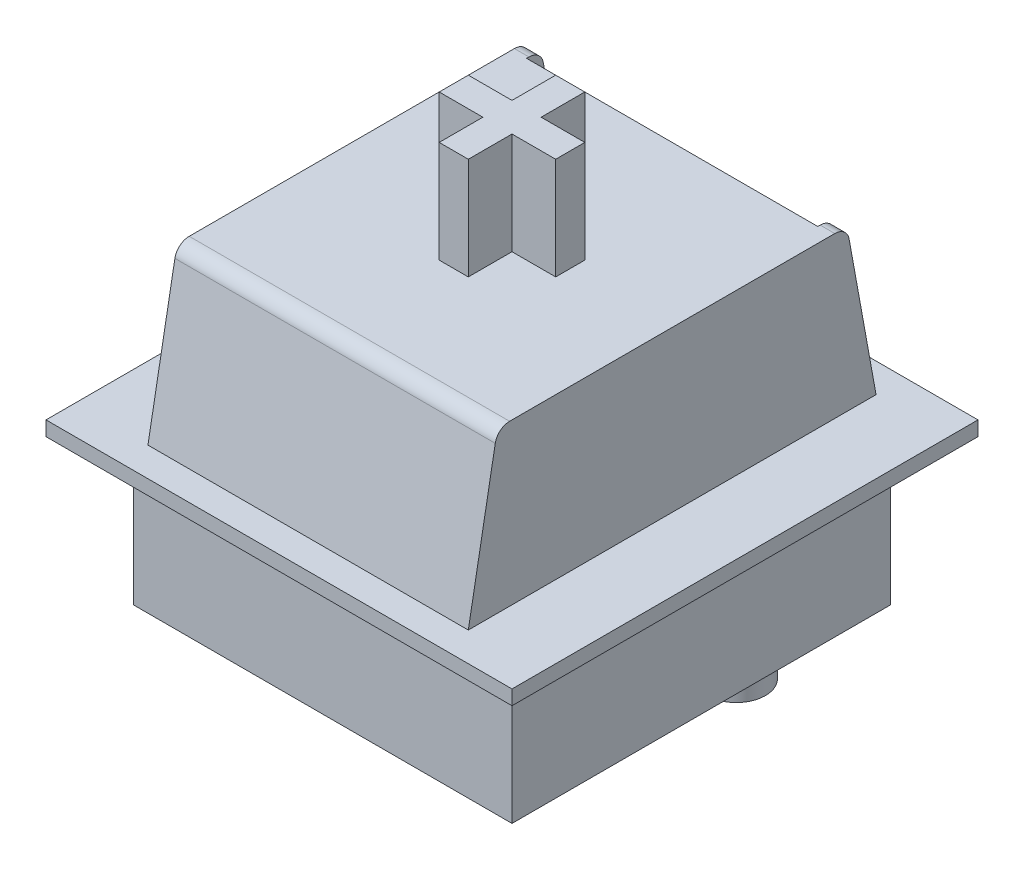
ISO-10303-21;
HEADER;
FILE_DESCRIPTION(('STEP AP214'),'2;1');
FILE_NAME('part.step','',(''),(''),'','','');
FILE_SCHEMA(('AUTOMOTIVE_DESIGN { 1 0 10303 214 1 1 1 1 }'));
ENDSEC;
DATA;
#1=APPLICATION_CONTEXT('core data for automotive mechanical design processes');
#2=APPLICATION_PROTOCOL_DEFINITION('international standard','automotive_design',2000,#1);
#3=PRODUCT_CONTEXT('',#1,'mechanical');
#4=PRODUCT('Part','Part','',(#3));
#5=PRODUCT_RELATED_PRODUCT_CATEGORY('part','',(#4));
#6=PRODUCT_DEFINITION_FORMATION('','',#4);
#7=PRODUCT_DEFINITION_CONTEXT('part definition',#1,'design');
#8=PRODUCT_DEFINITION('design','',#6,#7);
#9=PRODUCT_DEFINITION_SHAPE('','',#8);
#10=(LENGTH_UNIT() NAMED_UNIT(*) SI_UNIT(.MILLI.,.METRE.));
#11=(NAMED_UNIT(*) PLANE_ANGLE_UNIT() SI_UNIT($,.RADIAN.));
#12=(NAMED_UNIT(*) SI_UNIT($,.STERADIAN.) SOLID_ANGLE_UNIT());
#13=UNCERTAINTY_MEASURE_WITH_UNIT(LENGTH_MEASURE(1.E-05),#10,'distance_accuracy_value','');
#14=(GEOMETRIC_REPRESENTATION_CONTEXT(3) GLOBAL_UNCERTAINTY_ASSIGNED_CONTEXT((#13)) GLOBAL_UNIT_ASSIGNED_CONTEXT((#10,
#11,#12)) REPRESENTATION_CONTEXT('',''));
#15=CARTESIAN_POINT('',(0.,0.,0.));
#16=DIRECTION('',(0.,0.,1.));
#17=DIRECTION('',(1.,0.,0.));
#18=AXIS2_PLACEMENT_3D('',#15,#16,#17);
#19=CARTESIAN_POINT('',(0.,5.5,0.));
#20=DIRECTION('',(0.,1.,0.));
#21=DIRECTION('',(0.,0.,1.));
#22=AXIS2_PLACEMENT_3D('',#19,#20,#21);
#23=PLANE('',#22);
#24=DIRECTION('',(0.,0.,-1.));
#25=VECTOR('',#24,1.);
#26=CARTESIAN_POINT('',(13.5,5.5,-2.5));
#27=LINE('',#26,#25);
#28=CARTESIAN_POINT('',(13.5,5.5,-1.));
#29=VERTEX_POINT('',#28);
#30=CARTESIAN_POINT('',(13.5,5.5,-15.));
#31=VERTEX_POINT('',#30);
#32=EDGE_CURVE('E244',#29,#31,#27,.T.);
#33=ORIENTED_EDGE('',*,*,#32,.F.);
#34=DIRECTION('',(-1.,0.,0.));
#35=VECTOR('',#34,1.);
#36=CARTESIAN_POINT('',(13.5,5.5,-1.));
#37=LINE('',#36,#35);
#38=CARTESIAN_POINT('',(2.5,5.5,-0.999999999999999));
#39=VERTEX_POINT('',#38);
#40=EDGE_CURVE('E246',#29,#39,#37,.T.);
#41=ORIENTED_EDGE('',*,*,#40,.T.);
#42=DIRECTION('',(0.,0.,1.));
#43=VECTOR('',#42,1.);
#44=CARTESIAN_POINT('',(2.5,5.5,-13.5));
#45=LINE('',#44,#43);
#46=CARTESIAN_POINT('',(2.5,5.5,-15.));
#47=VERTEX_POINT('',#46);
#48=EDGE_CURVE('E254',#47,#39,#45,.T.);
#49=ORIENTED_EDGE('',*,*,#48,.F.);
#50=DIRECTION('',(-1.,0.,0.));
#51=VECTOR('',#50,1.);
#52=CARTESIAN_POINT('',(3.,5.5,-15.));
#53=LINE('',#52,#51);
#54=CARTESIAN_POINT('',(3.,5.5,-15.));
#55=VERTEX_POINT('',#54);
#56=EDGE_CURVE('E352',#55,#47,#53,.T.);
#57=ORIENTED_EDGE('',*,*,#56,.F.);
#58=DIRECTION('',(0.,0.,1.));
#59=VECTOR('',#58,1.);
#60=CARTESIAN_POINT('',(3.,5.5,-15.));
#61=LINE('',#60,#59);
#62=CARTESIAN_POINT('',(3.,5.5,-13.5));
#63=VERTEX_POINT('',#62);
#64=EDGE_CURVE('E341',#55,#63,#61,.T.);
#65=ORIENTED_EDGE('',*,*,#64,.T.);
#66=DIRECTION('',(-1.,0.,0.));
#67=VECTOR('',#66,1.);
#68=CARTESIAN_POINT('',(13.5,5.5,-13.5));
#69=LINE('',#68,#67);
#70=CARTESIAN_POINT('',(13.,5.5,-13.5));
#71=VERTEX_POINT('',#70);
#72=EDGE_CURVE('E363',#71,#63,#69,.T.);
#73=ORIENTED_EDGE('',*,*,#72,.F.);
#74=DIRECTION('',(0.,0.,-1.));
#75=VECTOR('',#74,1.);
#76=CARTESIAN_POINT('',(13.,5.5,-15.));
#77=LINE('',#76,#75);
#78=CARTESIAN_POINT('',(13.,5.5,-15.));
#79=VERTEX_POINT('',#78);
#80=EDGE_CURVE('E307',#71,#79,#77,.T.);
#81=ORIENTED_EDGE('',*,*,#80,.T.);
#82=DIRECTION('',(1.,0.,0.));
#83=VECTOR('',#82,1.);
#84=CARTESIAN_POINT('',(13.,5.5,-15.));
#85=LINE('',#84,#83);
#86=EDGE_CURVE('E248',#79,#31,#85,.T.);
#87=ORIENTED_EDGE('',*,*,#86,.T.);
#88=EDGE_LOOP('',(#33,#41,#49,#57,#65,#73,#81,#87));
#89=FACE_BOUND('',#88,.T.);
#90=DIRECTION('',(-1.,0.,0.));
#91=VECTOR('',#90,1.);
#92=CARTESIAN_POINT('',(16.,5.5,-16.));
#93=LINE('',#92,#91);
#94=CARTESIAN_POINT('',(16.,5.5,-16.));
#95=VERTEX_POINT('',#94);
#96=CARTESIAN_POINT('',(0.,5.5,-16.));
#97=VERTEX_POINT('',#96);
#98=EDGE_CURVE('E65',#95,#97,#93,.T.);
#99=ORIENTED_EDGE('',*,*,#98,.T.);
#100=DIRECTION('',(0.,0.,1.));
#101=VECTOR('',#100,1.);
#102=CARTESIAN_POINT('',(0.,5.5,-16.));
#103=LINE('',#102,#101);
#104=CARTESIAN_POINT('',(0.,5.5,0.));
#105=VERTEX_POINT('',#104);
#106=EDGE_CURVE('E378',#97,#105,#103,.T.);
#107=ORIENTED_EDGE('',*,*,#106,.T.);
#108=DIRECTION('',(1.,0.,0.));
#109=VECTOR('',#108,1.);
#110=CARTESIAN_POINT('',(0.,5.5,0.));
#111=LINE('',#110,#109);
#112=CARTESIAN_POINT('',(16.,5.5,0.));
#113=VERTEX_POINT('',#112);
#114=EDGE_CURVE('E381',#105,#113,#111,.T.);
#115=ORIENTED_EDGE('',*,*,#114,.T.);
#116=DIRECTION('',(0.,0.,-1.));
#117=VECTOR('',#116,1.);
#118=CARTESIAN_POINT('',(16.,5.5,0.));
#119=LINE('',#118,#117);
#120=EDGE_CURVE('E384',#113,#95,#119,.T.);
#121=ORIENTED_EDGE('',*,*,#120,.T.);
#122=EDGE_LOOP('',(#99,#107,#115,#121));
#123=FACE_BOUND('',#122,.T.);
#124=ADVANCED_FACE('F41',(#89,#123),#23,.T.);
#125=CARTESIAN_POINT('',(13.5,5.5,-13.5));
#126=DIRECTION('',(0.,0.,-1.));
#127=DIRECTION('',(-1.,0.,0.));
#128=AXIS2_PLACEMENT_3D('',#125,#126,#127);
#129=PLANE('',#128);
#130=DIRECTION('',(-1.,0.,0.));
#131=VECTOR('',#130,1.);
#132=CARTESIAN_POINT('',(13.5,11.,-13.5));
#133=LINE('',#132,#131);
#134=CARTESIAN_POINT('',(13.,11.,-13.5));
#135=VERTEX_POINT('',#134);
#136=CARTESIAN_POINT('',(3.,11.,-13.5));
#137=VERTEX_POINT('',#136);
#138=EDGE_CURVE('E356',#135,#137,#133,.T.);
#139=ORIENTED_EDGE('',*,*,#138,.F.);
#140=DIRECTION('',(0.,-1.,0.));
#141=VECTOR('',#140,1.);
#142=CARTESIAN_POINT('',(13.,5.5,-13.5));
#143=LINE('',#142,#141);
#144=EDGE_CURVE('E303',#135,#71,#143,.T.);
#145=ORIENTED_EDGE('',*,*,#144,.T.);
#146=ORIENTED_EDGE('',*,*,#72,.T.);
#147=DIRECTION('',(0.,1.,0.));
#148=VECTOR('',#147,1.);
#149=CARTESIAN_POINT('',(3.,11.,-13.5));
#150=LINE('',#149,#148);
#151=EDGE_CURVE('E325',#63,#137,#150,.T.);
#152=ORIENTED_EDGE('',*,*,#151,.T.);
#153=EDGE_LOOP('',(#139,#145,#146,#152));
#154=FACE_BOUND('',#153,.T.);
#155=ADVANCED_FACE('F615',(#154),#129,.T.);
#156=CARTESIAN_POINT('',(0.,11.,-16.));
#157=DIRECTION('',(0.,0.,1.));
#158=DIRECTION('',(1.,0.,0.));
#159=AXIS2_PLACEMENT_3D('',#156,#157,#158);
#160=PLANE('',#159);
#161=ORIENTED_EDGE('',*,*,#98,.F.);
#162=DIRECTION('',(0.,-1.,0.));
#163=VECTOR('',#162,1.);
#164=CARTESIAN_POINT('',(16.,11.,-16.));
#165=LINE('',#164,#163);
#166=CARTESIAN_POINT('',(16.,5.,-16.));
#167=VERTEX_POINT('',#166);
#168=EDGE_CURVE('E592',#95,#167,#165,.T.);
#169=ORIENTED_EDGE('',*,*,#168,.T.);
#170=DIRECTION('',(1.,0.,0.));
#171=VECTOR('',#170,1.);
#172=CARTESIAN_POINT('',(0.,5.,-16.));
#173=LINE('',#172,#171);
#174=CARTESIAN_POINT('',(0.,5.,-16.));
#175=VERTEX_POINT('',#174);
#176=EDGE_CURVE('E573',#175,#167,#173,.T.);
#177=ORIENTED_EDGE('',*,*,#176,.F.);
#178=DIRECTION('',(0.,-1.,0.));
#179=VECTOR('',#178,1.);
#180=CARTESIAN_POINT('',(0.,11.,-16.));
#181=LINE('',#180,#179);
#182=EDGE_CURVE('E586',#97,#175,#181,.T.);
#183=ORIENTED_EDGE('',*,*,#182,.F.);
#184=EDGE_LOOP('',(#161,#169,#177,#183));
#185=FACE_BOUND('',#184,.T.);
#186=ADVANCED_FACE('F613',(#185),#160,.F.);
#187=CARTESIAN_POINT('',(16.,11.,0.));
#188=DIRECTION('',(-1.,0.,0.));
#189=DIRECTION('',(0.,0.,1.));
#190=AXIS2_PLACEMENT_3D('',#187,#188,#189);
#191=PLANE('',#190);
#192=ORIENTED_EDGE('',*,*,#120,.F.);
#193=DIRECTION('',(0.,-1.,0.));
#194=VECTOR('',#193,1.);
#195=CARTESIAN_POINT('',(16.,11.,0.));
#196=LINE('',#195,#194);
#197=CARTESIAN_POINT('',(16.,5.,0.));
#198=VERTEX_POINT('',#197);
#199=EDGE_CURVE('E50',#113,#198,#196,.T.);
#200=ORIENTED_EDGE('',*,*,#199,.T.);
#201=DIRECTION('',(0.,0.,1.));
#202=VECTOR('',#201,1.);
#203=CARTESIAN_POINT('',(16.,5.,-16.));
#204=LINE('',#203,#202);
#205=EDGE_CURVE('E577',#167,#198,#204,.T.);
#206=ORIENTED_EDGE('',*,*,#205,.F.);
#207=ORIENTED_EDGE('',*,*,#168,.F.);
#208=EDGE_LOOP('',(#192,#200,#206,#207));
#209=FACE_BOUND('',#208,.T.);
#210=ADVANCED_FACE('F599',(#209),#191,.F.);
#211=CARTESIAN_POINT('',(0.,11.,0.));
#212=DIRECTION('',(0.,0.,-1.));
#213=DIRECTION('',(-1.,0.,0.));
#214=AXIS2_PLACEMENT_3D('',#211,#212,#213);
#215=PLANE('',#214);
#216=ORIENTED_EDGE('',*,*,#114,.F.);
#217=DIRECTION('',(0.,-1.,0.));
#218=VECTOR('',#217,1.);
#219=CARTESIAN_POINT('',(0.,11.,0.));
#220=LINE('',#219,#218);
#221=CARTESIAN_POINT('',(0.,5.,0.));
#222=VERTEX_POINT('',#221);
#223=EDGE_CURVE('E11',#105,#222,#220,.T.);
#224=ORIENTED_EDGE('',*,*,#223,.T.);
#225=DIRECTION('',(-1.,0.,0.));
#226=VECTOR('',#225,1.);
#227=CARTESIAN_POINT('',(16.,5.,0.));
#228=LINE('',#227,#226);
#229=EDGE_CURVE('E556',#198,#222,#228,.T.);
#230=ORIENTED_EDGE('',*,*,#229,.F.);
#231=ORIENTED_EDGE('',*,*,#199,.F.);
#232=EDGE_LOOP('',(#216,#224,#230,#231));
#233=FACE_BOUND('',#232,.T.);
#234=ADVANCED_FACE('F608',(#233),#215,.F.);
#235=CARTESIAN_POINT('',(0.,11.,0.));
#236=DIRECTION('',(1.,0.,0.));
#237=DIRECTION('',(0.,0.,-1.));
#238=AXIS2_PLACEMENT_3D('',#235,#236,#237);
#239=PLANE('',#238);
#240=ORIENTED_EDGE('',*,*,#106,.F.);
#241=ORIENTED_EDGE('',*,*,#182,.T.);
#242=DIRECTION('',(0.,0.,-1.));
#243=VECTOR('',#242,1.);
#244=CARTESIAN_POINT('',(0.,5.,0.));
#245=LINE('',#244,#243);
#246=EDGE_CURVE('E569',#222,#175,#245,.T.);
#247=ORIENTED_EDGE('',*,*,#246,.F.);
#248=ORIENTED_EDGE('',*,*,#223,.F.);
#249=EDGE_LOOP('',(#240,#241,#247,#248));
#250=FACE_BOUND('',#249,.T.);
#251=ADVANCED_FACE('F43',(#250),#239,.F.);
#252=CARTESIAN_POINT('',(0.,0.,0.));
#253=DIRECTION('',(0.,-1.,0.));
#254=DIRECTION('',(0.,0.,-1.));
#255=AXIS2_PLACEMENT_3D('',#252,#253,#254);
#256=PLANE('',#255);
#257=CARTESIAN_POINT('',(10.55,0.,-13.15));
#258=DIRECTION('',(0.,-1.,0.));
#259=DIRECTION('',(0.,0.,-1.));
#260=AXIS2_PLACEMENT_3D('',#257,#258,#259);
#261=CIRCLE('',#260,1.);
#262=CARTESIAN_POINT('',(10.55,0.,-14.15));
#263=VERTEX_POINT('',#262);
#264=EDGE_CURVE('E726',#263,#263,#261,.T.);
#265=ORIENTED_EDGE('',*,*,#264,.F.);
#266=EDGE_LOOP('',(#265));
#267=FACE_BOUND('',#266,.T.);
#268=CARTESIAN_POINT('',(4.3,0.,-10.65));
#269=DIRECTION('',(0.,-1.,0.));
#270=DIRECTION('',(0.,0.,-1.));
#271=AXIS2_PLACEMENT_3D('',#268,#269,#270);
#272=CIRCLE('',#271,1.);
#273=CARTESIAN_POINT('',(4.3,0.,-11.65));
#274=VERTEX_POINT('',#273);
#275=EDGE_CURVE('E279',#274,#274,#272,.T.);
#276=ORIENTED_EDGE('',*,*,#275,.F.);
#277=EDGE_LOOP('',(#276));
#278=FACE_BOUND('',#277,.T.);
#279=CARTESIAN_POINT('',(8.,0.,-8.));
#280=DIRECTION('',(0.,-1.,0.));
#281=DIRECTION('',(0.,0.,-1.));
#282=AXIS2_PLACEMENT_3D('',#279,#280,#281);
#283=CIRCLE('',#282,1.5);
#284=CARTESIAN_POINT('',(8.,0.,-9.5));
#285=VERTEX_POINT('',#284);
#286=EDGE_CURVE('E581',#285,#285,#283,.T.);
#287=ORIENTED_EDGE('',*,*,#286,.F.);
#288=EDGE_LOOP('',(#287));
#289=FACE_BOUND('',#288,.T.);
#290=DIRECTION('',(0.,0.,1.));
#291=VECTOR('',#290,1.);
#292=CARTESIAN_POINT('',(14.5,0.,-14.5));
#293=LINE('',#292,#291);
#294=CARTESIAN_POINT('',(14.5,0.,-14.5));
#295=VERTEX_POINT('',#294);
#296=CARTESIAN_POINT('',(14.5,0.,-1.5));
#297=VERTEX_POINT('',#296);
#298=EDGE_CURVE('E526',#295,#297,#293,.T.);
#299=ORIENTED_EDGE('',*,*,#298,.T.);
#300=DIRECTION('',(-1.,0.,0.));
#301=VECTOR('',#300,1.);
#302=CARTESIAN_POINT('',(14.5,0.,-1.5));
#303=LINE('',#302,#301);
#304=CARTESIAN_POINT('',(1.5,0.,-1.5));
#305=VERTEX_POINT('',#304);
#306=EDGE_CURVE('E520',#297,#305,#303,.T.);
#307=ORIENTED_EDGE('',*,*,#306,.T.);
#308=DIRECTION('',(0.,0.,-1.));
#309=VECTOR('',#308,1.);
#310=CARTESIAN_POINT('',(1.5,0.,-1.5));
#311=LINE('',#310,#309);
#312=CARTESIAN_POINT('',(1.5,0.,-14.5));
#313=VERTEX_POINT('',#312);
#314=EDGE_CURVE('E542',#305,#313,#311,.T.);
#315=ORIENTED_EDGE('',*,*,#314,.T.);
#316=DIRECTION('',(1.,0.,0.));
#317=VECTOR('',#316,1.);
#318=CARTESIAN_POINT('',(1.5,0.,-14.5));
#319=LINE('',#318,#317);
#320=EDGE_CURVE('E546',#313,#295,#319,.T.);
#321=ORIENTED_EDGE('',*,*,#320,.T.);
#322=EDGE_LOOP('',(#299,#307,#315,#321));
#323=FACE_BOUND('',#322,.T.);
#324=ADVANCED_FACE('F711',(#267,#278,#289,#323),#256,.T.);
#325=CARTESIAN_POINT('',(8.,-3.,-8.));
#326=DIRECTION('',(0.,1.,0.));
#327=DIRECTION('',(0.,0.,1.));
#328=AXIS2_PLACEMENT_3D('',#325,#326,#327);
#329=CYLINDRICAL_SURFACE('',#328,1.5);
#330=CARTESIAN_POINT('',(8.,-3.,-8.));
#331=DIRECTION('',(0.,-1.,0.));
#332=DIRECTION('',(0.,0.,-1.));
#333=AXIS2_PLACEMENT_3D('',#330,#331,#332);
#334=CIRCLE('',#333,1.5);
#335=CARTESIAN_POINT('',(8.,-3.,-9.5));
#336=VERTEX_POINT('',#335);
#337=EDGE_CURVE('E582',#336,#336,#334,.T.);
#338=ORIENTED_EDGE('',*,*,#337,.F.);
#339=EDGE_LOOP('',(#338));
#340=FACE_BOUND('',#339,.T.);
#341=ORIENTED_EDGE('',*,*,#286,.T.);
#342=EDGE_LOOP('',(#341));
#343=FACE_BOUND('',#342,.T.);
#344=ADVANCED_FACE('F707',(#340,#343),#329,.T.);
#345=CARTESIAN_POINT('',(8.,-3.,-8.));
#346=DIRECTION('',(0.,-1.,0.));
#347=DIRECTION('',(0.,0.,-1.));
#348=AXIS2_PLACEMENT_3D('',#345,#346,#347);
#349=PLANE('',#348);
#350=ORIENTED_EDGE('',*,*,#337,.T.);
#351=EDGE_LOOP('',(#350));
#352=FACE_BOUND('',#351,.T.);
#353=ADVANCED_FACE('F703',(#352),#349,.T.);
#354=CARTESIAN_POINT('',(0.,5.,0.));
#355=DIRECTION('',(0.,-1.,0.));
#356=DIRECTION('',(0.,0.,-1.));
#357=AXIS2_PLACEMENT_3D('',#354,#355,#356);
#358=PLANE('',#357);
#359=DIRECTION('',(0.,0.,1.));
#360=VECTOR('',#359,1.);
#361=CARTESIAN_POINT('',(14.5,5.,-14.5));
#362=LINE('',#361,#360);
#363=CARTESIAN_POINT('',(14.5,5.,-14.5));
#364=VERTEX_POINT('',#363);
#365=CARTESIAN_POINT('',(14.5,5.,-1.5));
#366=VERTEX_POINT('',#365);
#367=EDGE_CURVE('E534',#364,#366,#362,.T.);
#368=ORIENTED_EDGE('',*,*,#367,.F.);
#369=DIRECTION('',(1.,0.,0.));
#370=VECTOR('',#369,1.);
#371=CARTESIAN_POINT('',(1.5,5.,-14.5));
#372=LINE('',#371,#370);
#373=CARTESIAN_POINT('',(1.5,5.,-14.5));
#374=VERTEX_POINT('',#373);
#375=EDGE_CURVE('E530',#374,#364,#372,.T.);
#376=ORIENTED_EDGE('',*,*,#375,.F.);
#377=DIRECTION('',(0.,0.,-1.));
#378=VECTOR('',#377,1.);
#379=CARTESIAN_POINT('',(1.5,5.,-1.5));
#380=LINE('',#379,#378);
#381=CARTESIAN_POINT('',(1.5,5.,-1.5));
#382=VERTEX_POINT('',#381);
#383=EDGE_CURVE('E525',#382,#374,#380,.T.);
#384=ORIENTED_EDGE('',*,*,#383,.F.);
#385=DIRECTION('',(-1.,0.,0.));
#386=VECTOR('',#385,1.);
#387=CARTESIAN_POINT('',(14.5,5.,-1.5));
#388=LINE('',#387,#386);
#389=EDGE_CURVE('E521',#366,#382,#388,.T.);
#390=ORIENTED_EDGE('',*,*,#389,.F.);
#391=EDGE_LOOP('',(#368,#376,#384,#390));
#392=FACE_BOUND('',#391,.T.);
#393=ORIENTED_EDGE('',*,*,#229,.T.);
#394=ORIENTED_EDGE('',*,*,#246,.T.);
#395=ORIENTED_EDGE('',*,*,#176,.T.);
#396=ORIENTED_EDGE('',*,*,#205,.T.);
#397=EDGE_LOOP('',(#393,#394,#395,#396));
#398=FACE_BOUND('',#397,.T.);
#399=ADVANCED_FACE('F605',(#392,#398),#358,.T.);
#400=CARTESIAN_POINT('',(14.5,5.,-1.5));
#401=DIRECTION('',(0.,0.,1.));
#402=DIRECTION('',(1.,0.,0.));
#403=AXIS2_PLACEMENT_3D('',#400,#401,#402);
#404=PLANE('',#403);
#405=ORIENTED_EDGE('',*,*,#306,.F.);
#406=DIRECTION('',(0.,-1.,0.));
#407=VECTOR('',#406,1.);
#408=CARTESIAN_POINT('',(14.5,5.,-1.5));
#409=LINE('',#408,#407);
#410=EDGE_CURVE('E553',#366,#297,#409,.T.);
#411=ORIENTED_EDGE('',*,*,#410,.F.);
#412=ORIENTED_EDGE('',*,*,#389,.T.);
#413=DIRECTION('',(0.,-1.,0.));
#414=VECTOR('',#413,1.);
#415=CARTESIAN_POINT('',(1.5,5.,-1.5));
#416=LINE('',#415,#414);
#417=EDGE_CURVE('E538',#382,#305,#416,.T.);
#418=ORIENTED_EDGE('',*,*,#417,.T.);
#419=EDGE_LOOP('',(#405,#411,#412,#418));
#420=FACE_BOUND('',#419,.T.);
#421=ADVANCED_FACE('F689',(#420),#404,.T.);
#422=CARTESIAN_POINT('',(14.5,5.,-14.5));
#423=DIRECTION('',(1.,0.,0.));
#424=DIRECTION('',(0.,0.,-1.));
#425=AXIS2_PLACEMENT_3D('',#422,#423,#424);
#426=PLANE('',#425);
#427=ORIENTED_EDGE('',*,*,#298,.F.);
#428=DIRECTION('',(0.,-1.,0.));
#429=VECTOR('',#428,1.);
#430=CARTESIAN_POINT('',(14.5,5.,-14.5));
#431=LINE('',#430,#429);
#432=EDGE_CURVE('E557',#364,#295,#431,.T.);
#433=ORIENTED_EDGE('',*,*,#432,.F.);
#434=ORIENTED_EDGE('',*,*,#367,.T.);
#435=ORIENTED_EDGE('',*,*,#410,.T.);
#436=EDGE_LOOP('',(#427,#433,#434,#435));
#437=FACE_BOUND('',#436,.T.);
#438=ADVANCED_FACE('F685',(#437),#426,.T.);
#439=CARTESIAN_POINT('',(1.5,5.,-14.5));
#440=DIRECTION('',(0.,0.,-1.));
#441=DIRECTION('',(-1.,0.,0.));
#442=AXIS2_PLACEMENT_3D('',#439,#440,#441);
#443=PLANE('',#442);
#444=ORIENTED_EDGE('',*,*,#320,.F.);
#445=DIRECTION('',(0.,-1.,0.));
#446=VECTOR('',#445,1.);
#447=CARTESIAN_POINT('',(1.5,5.,-14.5));
#448=LINE('',#447,#446);
#449=EDGE_CURVE('E560',#374,#313,#448,.T.);
#450=ORIENTED_EDGE('',*,*,#449,.F.);
#451=ORIENTED_EDGE('',*,*,#375,.T.);
#452=ORIENTED_EDGE('',*,*,#432,.T.);
#453=EDGE_LOOP('',(#444,#450,#451,#452));
#454=FACE_BOUND('',#453,.T.);
#455=ADVANCED_FACE('F688',(#454),#443,.T.);
#456=CARTESIAN_POINT('',(1.5,5.,-1.5));
#457=DIRECTION('',(-1.,0.,0.));
#458=DIRECTION('',(0.,0.,1.));
#459=AXIS2_PLACEMENT_3D('',#456,#457,#458);
#460=PLANE('',#459);
#461=ORIENTED_EDGE('',*,*,#314,.F.);
#462=ORIENTED_EDGE('',*,*,#417,.F.);
#463=ORIENTED_EDGE('',*,*,#383,.T.);
#464=ORIENTED_EDGE('',*,*,#449,.T.);
#465=EDGE_LOOP('',(#461,#462,#463,#464));
#466=FACE_BOUND('',#465,.T.);
#467=ADVANCED_FACE('F693',(#466),#460,.T.);
#468=CARTESIAN_POINT('',(13.5,5.5,-2.5));
#469=DIRECTION('',(1.,0.,0.));
#470=DIRECTION('',(0.,0.,-1.));
#471=AXIS2_PLACEMENT_3D('',#468,#469,#470);
#472=PLANE('',#471);
#473=DIRECTION('',(0.,0.,-1.));
#474=VECTOR('',#473,1.);
#475=CARTESIAN_POINT('',(13.5,11.,-2.5));
#476=LINE('',#475,#474);
#477=CARTESIAN_POINT('',(13.5,11.,-2.4172881767045));
#478=VERTEX_POINT('',#477);
#479=CARTESIAN_POINT('',(13.5,11.,-13.5827118232955));
#480=VERTEX_POINT('',#479);
#481=EDGE_CURVE('E366',#478,#480,#476,.T.);
#482=ORIENTED_EDGE('',*,*,#481,.F.);
#483=CARTESIAN_POINT('',(13.5,10.5,-2.4172881767045));
#484=DIRECTION('',(-1.,0.,0.));
#485=DIRECTION('',(0.,0.,-1.));
#486=AXIS2_PLACEMENT_3D('',#483,#484,#485);
#487=CIRCLE('',#486,0.5);
#488=CARTESIAN_POINT('',(13.5,10.5894427191,-1.92535322165454));
#489=VERTEX_POINT('',#488);
#490=EDGE_CURVE('E265',#489,#478,#487,.T.);
#491=ORIENTED_EDGE('',*,*,#490,.F.);
#492=DIRECTION('',(0.,0.983869910099908,-0.178885438199983));
#493=VECTOR('',#492,1.);
#494=CARTESIAN_POINT('',(13.5,10.5894427191,-1.92535322165455));
#495=LINE('',#494,#493);
#496=EDGE_CURVE('E260',#29,#489,#495,.T.);
#497=ORIENTED_EDGE('',*,*,#496,.F.);
#498=ORIENTED_EDGE('',*,*,#32,.T.);
#499=DIRECTION('',(0.,0.983869910099908,0.178885438199982));
#500=VECTOR('',#499,1.);
#501=CARTESIAN_POINT('',(13.5,10.5894427191,-14.0746467783455));
#502=LINE('',#501,#500);
#503=CARTESIAN_POINT('',(13.5,10.5894427191,-14.0746467783455));
#504=VERTEX_POINT('',#503);
#505=EDGE_CURVE('E289',#31,#504,#502,.T.);
#506=ORIENTED_EDGE('',*,*,#505,.T.);
#507=CARTESIAN_POINT('',(13.5,10.5,-13.5827118232955));
#508=DIRECTION('',(1.,0.,0.));
#509=DIRECTION('',(0.,0.,-1.));
#510=AXIS2_PLACEMENT_3D('',#507,#508,#509);
#511=CIRCLE('',#510,0.5);
#512=EDGE_CURVE('E297',#504,#480,#511,.T.);
#513=ORIENTED_EDGE('',*,*,#512,.T.);
#514=EDGE_LOOP('',(#482,#491,#497,#498,#506,#513));
#515=FACE_BOUND('',#514,.T.);
#516=ADVANCED_FACE('F268',(#515),#472,.T.);
#517=CARTESIAN_POINT('',(2.5,5.5,-13.5));
#518=DIRECTION('',(-1.,0.,0.));
#519=DIRECTION('',(0.,0.,1.));
#520=AXIS2_PLACEMENT_3D('',#517,#518,#519);
#521=PLANE('',#520);
#522=DIRECTION('',(0.,0.,1.));
#523=VECTOR('',#522,1.);
#524=CARTESIAN_POINT('',(2.5,11.,-13.5));
#525=LINE('',#524,#523);
#526=CARTESIAN_POINT('',(2.5,11.,-13.5827118232955));
#527=VERTEX_POINT('',#526);
#528=CARTESIAN_POINT('',(2.5,11.,-2.4172881767045));
#529=VERTEX_POINT('',#528);
#530=EDGE_CURVE('E371',#527,#529,#525,.T.);
#531=ORIENTED_EDGE('',*,*,#530,.F.);
#532=CARTESIAN_POINT('',(2.5,10.5,-13.5827118232955));
#533=DIRECTION('',(-1.,0.,0.));
#534=DIRECTION('',(0.,0.,1.));
#535=AXIS2_PLACEMENT_3D('',#532,#533,#534);
#536=CIRCLE('',#535,0.5);
#537=CARTESIAN_POINT('',(2.5,10.5894427191,-14.0746467783455));
#538=VERTEX_POINT('',#537);
#539=EDGE_CURVE('E318',#527,#538,#536,.T.);
#540=ORIENTED_EDGE('',*,*,#539,.T.);
#541=DIRECTION('',(0.,-0.983869910099908,-0.178885438199982));
#542=VECTOR('',#541,1.);
#543=CARTESIAN_POINT('',(2.5,10.5894427191,-14.0746467783455));
#544=LINE('',#543,#542);
#545=EDGE_CURVE('E330',#538,#47,#544,.T.);
#546=ORIENTED_EDGE('',*,*,#545,.T.);
#547=ORIENTED_EDGE('',*,*,#48,.T.);
#548=DIRECTION('',(0.,0.983869910099908,-0.178885438199983));
#549=VECTOR('',#548,1.);
#550=CARTESIAN_POINT('',(2.5,10.5894427191,-1.92535322165454));
#551=LINE('',#550,#549);
#552=CARTESIAN_POINT('',(2.5,10.5894427191,-1.92535322165454));
#553=VERTEX_POINT('',#552);
#554=EDGE_CURVE('E262',#39,#553,#551,.T.);
#555=ORIENTED_EDGE('',*,*,#554,.T.);
#556=CARTESIAN_POINT('',(2.5,10.5,-2.4172881767045));
#557=DIRECTION('',(-1.,0.,0.));
#558=DIRECTION('',(0.,0.,-1.));
#559=AXIS2_PLACEMENT_3D('',#556,#557,#558);
#560=CIRCLE('',#559,0.5);
#561=EDGE_CURVE('E271',#553,#529,#560,.T.);
#562=ORIENTED_EDGE('',*,*,#561,.T.);
#563=EDGE_LOOP('',(#531,#540,#546,#547,#555,#562));
#564=FACE_BOUND('',#563,.T.);
#565=ADVANCED_FACE('F635',(#564),#521,.T.);
#566=CARTESIAN_POINT('',(0.,14.5,0.));
#567=DIRECTION('',(0.,-1.,0.));
#568=DIRECTION('',(0.,0.,-1.));
#569=AXIS2_PLACEMENT_3D('',#566,#567,#568);
#570=PLANE('',#569);
#571=DIRECTION('',(-1.,0.,0.));
#572=VECTOR('',#571,1.);
#573=CARTESIAN_POINT('',(7.5,14.5,-10.));
#574=LINE('',#573,#572);
#575=CARTESIAN_POINT('',(8.5,14.5,-10.));
#576=VERTEX_POINT('',#575);
#577=CARTESIAN_POINT('',(7.5,14.5,-10.));
#578=VERTEX_POINT('',#577);
#579=EDGE_CURVE('E388',#576,#578,#574,.T.);
#580=ORIENTED_EDGE('',*,*,#579,.T.);
#581=DIRECTION('',(0.,0.,1.));
#582=VECTOR('',#581,1.);
#583=CARTESIAN_POINT('',(7.5,14.5,-10.));
#584=LINE('',#583,#582);
#585=CARTESIAN_POINT('',(7.5,14.5,-8.5));
#586=VERTEX_POINT('',#585);
#587=EDGE_CURVE('E392',#578,#586,#584,.T.);
#588=ORIENTED_EDGE('',*,*,#587,.T.);
#589=DIRECTION('',(-1.,0.,0.));
#590=VECTOR('',#589,1.);
#591=CARTESIAN_POINT('',(7.5,14.5,-8.5));
#592=LINE('',#591,#590);
#593=CARTESIAN_POINT('',(6.,14.5,-8.5));
#594=VERTEX_POINT('',#593);
#595=EDGE_CURVE('E396',#586,#594,#592,.T.);
#596=ORIENTED_EDGE('',*,*,#595,.T.);
#597=DIRECTION('',(0.,0.,1.));
#598=VECTOR('',#597,1.);
#599=CARTESIAN_POINT('',(6.,14.5,-8.5));
#600=LINE('',#599,#598);
#601=CARTESIAN_POINT('',(6.,14.5,-7.5));
#602=VERTEX_POINT('',#601);
#603=EDGE_CURVE('E399',#594,#602,#600,.T.);
#604=ORIENTED_EDGE('',*,*,#603,.T.);
#605=DIRECTION('',(1.,0.,0.));
#606=VECTOR('',#605,1.);
#607=CARTESIAN_POINT('',(7.5,14.5,-7.5));
#608=LINE('',#607,#606);
#609=CARTESIAN_POINT('',(7.5,14.5,-7.5));
#610=VERTEX_POINT('',#609);
#611=EDGE_CURVE('E402',#602,#610,#608,.T.);
#612=ORIENTED_EDGE('',*,*,#611,.T.);
#613=DIRECTION('',(0.,0.,1.));
#614=VECTOR('',#613,1.);
#615=CARTESIAN_POINT('',(7.5,14.5,-6.));
#616=LINE('',#615,#614);
#617=CARTESIAN_POINT('',(7.5,14.5,-6.));
#618=VERTEX_POINT('',#617);
#619=EDGE_CURVE('E405',#610,#618,#616,.T.);
#620=ORIENTED_EDGE('',*,*,#619,.T.);
#621=DIRECTION('',(1.,0.,0.));
#622=VECTOR('',#621,1.);
#623=CARTESIAN_POINT('',(7.5,14.5,-6.));
#624=LINE('',#623,#622);
#625=CARTESIAN_POINT('',(8.5,14.5,-6.));
#626=VERTEX_POINT('',#625);
#627=EDGE_CURVE('E408',#618,#626,#624,.T.);
#628=ORIENTED_EDGE('',*,*,#627,.T.);
#629=DIRECTION('',(0.,0.,-1.));
#630=VECTOR('',#629,1.);
#631=CARTESIAN_POINT('',(8.5,14.5,-6.));
#632=LINE('',#631,#630);
#633=CARTESIAN_POINT('',(8.5,14.5,-7.5));
#634=VERTEX_POINT('',#633);
#635=EDGE_CURVE('E411',#626,#634,#632,.T.);
#636=ORIENTED_EDGE('',*,*,#635,.T.);
#637=DIRECTION('',(1.,0.,0.));
#638=VECTOR('',#637,1.);
#639=CARTESIAN_POINT('',(8.5,14.5,-7.5));
#640=LINE('',#639,#638);
#641=CARTESIAN_POINT('',(10.,14.5,-7.5));
#642=VERTEX_POINT('',#641);
#643=EDGE_CURVE('E414',#634,#642,#640,.T.);
#644=ORIENTED_EDGE('',*,*,#643,.T.);
#645=DIRECTION('',(0.,0.,-1.));
#646=VECTOR('',#645,1.);
#647=CARTESIAN_POINT('',(10.,14.5,-8.5));
#648=LINE('',#647,#646);
#649=CARTESIAN_POINT('',(10.,14.5,-8.5));
#650=VERTEX_POINT('',#649);
#651=EDGE_CURVE('E417',#642,#650,#648,.T.);
#652=ORIENTED_EDGE('',*,*,#651,.T.);
#653=DIRECTION('',(-1.,0.,0.));
#654=VECTOR('',#653,1.);
#655=CARTESIAN_POINT('',(8.5,14.5,-8.5));
#656=LINE('',#655,#654);
#657=CARTESIAN_POINT('',(8.5,14.5,-8.5));
#658=VERTEX_POINT('',#657);
#659=EDGE_CURVE('E420',#650,#658,#656,.T.);
#660=ORIENTED_EDGE('',*,*,#659,.T.);
#661=DIRECTION('',(0.,0.,-1.));
#662=VECTOR('',#661,1.);
#663=CARTESIAN_POINT('',(8.5,14.5,-10.));
#664=LINE('',#663,#662);
#665=EDGE_CURVE('E423',#658,#576,#664,.T.);
#666=ORIENTED_EDGE('',*,*,#665,.T.);
#667=EDGE_LOOP('',(#580,#588,#596,#604,#612,#620,#628,#636,#644,#652,#660,#666));
#668=FACE_BOUND('',#667,.T.);
#669=ADVANCED_FACE('F631',(#668),#570,.F.);
#670=CARTESIAN_POINT('',(7.5,14.5,-10.));
#671=DIRECTION('',(1.,0.,0.));
#672=DIRECTION('',(0.,0.,-1.));
#673=AXIS2_PLACEMENT_3D('',#670,#671,#672);
#674=PLANE('',#673);
#675=DIRECTION('',(0.,0.,1.));
#676=VECTOR('',#675,1.);
#677=CARTESIAN_POINT('',(7.5,11.,-10.));
#678=LINE('',#677,#676);
#679=CARTESIAN_POINT('',(7.5,11.,-10.));
#680=VERTEX_POINT('',#679);
#681=CARTESIAN_POINT('',(7.5,11.,-8.5));
#682=VERTEX_POINT('',#681);
#683=EDGE_CURVE('E430',#680,#682,#678,.T.);
#684=ORIENTED_EDGE('',*,*,#683,.T.);
#685=DIRECTION('',(0.,-1.,0.));
#686=VECTOR('',#685,1.);
#687=CARTESIAN_POINT('',(7.5,14.5,-8.5));
#688=LINE('',#687,#686);
#689=EDGE_CURVE('E512',#586,#682,#688,.T.);
#690=ORIENTED_EDGE('',*,*,#689,.F.);
#691=ORIENTED_EDGE('',*,*,#587,.F.);
#692=DIRECTION('',(0.,-1.,0.));
#693=VECTOR('',#692,1.);
#694=CARTESIAN_POINT('',(7.5,14.5,-10.));
#695=LINE('',#694,#693);
#696=EDGE_CURVE('E516',#578,#680,#695,.T.);
#697=ORIENTED_EDGE('',*,*,#696,.T.);
#698=EDGE_LOOP('',(#684,#690,#691,#697));
#699=FACE_BOUND('',#698,.T.);
#700=ADVANCED_FACE('F634',(#699),#674,.F.);
#701=CARTESIAN_POINT('',(7.5,14.5,-8.5));
#702=DIRECTION('',(0.,0.,1.));
#703=DIRECTION('',(1.,0.,0.));
#704=AXIS2_PLACEMENT_3D('',#701,#702,#703);
#705=PLANE('',#704);
#706=DIRECTION('',(-1.,0.,0.));
#707=VECTOR('',#706,1.);
#708=CARTESIAN_POINT('',(7.5,11.,-8.5));
#709=LINE('',#708,#707);
#710=CARTESIAN_POINT('',(6.,11.,-8.5));
#711=VERTEX_POINT('',#710);
#712=EDGE_CURVE('E434',#682,#711,#709,.T.);
#713=ORIENTED_EDGE('',*,*,#712,.T.);
#714=DIRECTION('',(0.,-1.,0.));
#715=VECTOR('',#714,1.);
#716=CARTESIAN_POINT('',(6.,14.5,-8.5));
#717=LINE('',#716,#715);
#718=EDGE_CURVE('E508',#594,#711,#717,.T.);
#719=ORIENTED_EDGE('',*,*,#718,.F.);
#720=ORIENTED_EDGE('',*,*,#595,.F.);
#721=ORIENTED_EDGE('',*,*,#689,.T.);
#722=EDGE_LOOP('',(#713,#719,#720,#721));
#723=FACE_BOUND('',#722,.T.);
#724=ADVANCED_FACE('F673',(#723),#705,.F.);
#725=CARTESIAN_POINT('',(6.,14.5,-8.5));
#726=DIRECTION('',(1.,0.,0.));
#727=DIRECTION('',(0.,0.,-1.));
#728=AXIS2_PLACEMENT_3D('',#725,#726,#727);
#729=PLANE('',#728);
#730=DIRECTION('',(0.,0.,1.));
#731=VECTOR('',#730,1.);
#732=CARTESIAN_POINT('',(6.,11.,-8.5));
#733=LINE('',#732,#731);
#734=CARTESIAN_POINT('',(6.,11.,-7.5));
#735=VERTEX_POINT('',#734);
#736=EDGE_CURVE('E438',#711,#735,#733,.T.);
#737=ORIENTED_EDGE('',*,*,#736,.T.);
#738=DIRECTION('',(0.,-1.,0.));
#739=VECTOR('',#738,1.);
#740=CARTESIAN_POINT('',(6.,14.5,-7.5));
#741=LINE('',#740,#739);
#742=EDGE_CURVE('E504',#602,#735,#741,.T.);
#743=ORIENTED_EDGE('',*,*,#742,.F.);
#744=ORIENTED_EDGE('',*,*,#603,.F.);
#745=ORIENTED_EDGE('',*,*,#718,.T.);
#746=EDGE_LOOP('',(#737,#743,#744,#745));
#747=FACE_BOUND('',#746,.T.);
#748=ADVANCED_FACE('F669',(#747),#729,.F.);
#749=CARTESIAN_POINT('',(7.5,14.5,-7.5));
#750=DIRECTION('',(0.,0.,-1.));
#751=DIRECTION('',(-1.,0.,0.));
#752=AXIS2_PLACEMENT_3D('',#749,#750,#751);
#753=PLANE('',#752);
#754=DIRECTION('',(1.,0.,0.));
#755=VECTOR('',#754,1.);
#756=CARTESIAN_POINT('',(7.5,11.,-7.5));
#757=LINE('',#756,#755);
#758=CARTESIAN_POINT('',(7.5,11.,-7.5));
#759=VERTEX_POINT('',#758);
#760=EDGE_CURVE('E442',#735,#759,#757,.T.);
#761=ORIENTED_EDGE('',*,*,#760,.T.);
#762=DIRECTION('',(0.,-1.,0.));
#763=VECTOR('',#762,1.);
#764=CARTESIAN_POINT('',(7.5,14.5,-7.5));
#765=LINE('',#764,#763);
#766=EDGE_CURVE('E500',#610,#759,#765,.T.);
#767=ORIENTED_EDGE('',*,*,#766,.F.);
#768=ORIENTED_EDGE('',*,*,#611,.F.);
#769=ORIENTED_EDGE('',*,*,#742,.T.);
#770=EDGE_LOOP('',(#761,#767,#768,#769));
#771=FACE_BOUND('',#770,.T.);
#772=ADVANCED_FACE('F665',(#771),#753,.F.);
#773=CARTESIAN_POINT('',(7.5,14.5,-6.));
#774=DIRECTION('',(1.,0.,0.));
#775=DIRECTION('',(0.,0.,-1.));
#776=AXIS2_PLACEMENT_3D('',#773,#774,#775);
#777=PLANE('',#776);
#778=DIRECTION('',(0.,0.,1.));
#779=VECTOR('',#778,1.);
#780=CARTESIAN_POINT('',(7.5,11.,-6.));
#781=LINE('',#780,#779);
#782=CARTESIAN_POINT('',(7.5,11.,-6.));
#783=VERTEX_POINT('',#782);
#784=EDGE_CURVE('E446',#759,#783,#781,.T.);
#785=ORIENTED_EDGE('',*,*,#784,.T.);
#786=DIRECTION('',(0.,-1.,0.));
#787=VECTOR('',#786,1.);
#788=CARTESIAN_POINT('',(7.5,14.5,-6.));
#789=LINE('',#788,#787);
#790=EDGE_CURVE('E496',#618,#783,#789,.T.);
#791=ORIENTED_EDGE('',*,*,#790,.F.);
#792=ORIENTED_EDGE('',*,*,#619,.F.);
#793=ORIENTED_EDGE('',*,*,#766,.T.);
#794=EDGE_LOOP('',(#785,#791,#792,#793));
#795=FACE_BOUND('',#794,.T.);
#796=ADVANCED_FACE('F661',(#795),#777,.F.);
#797=CARTESIAN_POINT('',(7.5,14.5,-6.));
#798=DIRECTION('',(0.,0.,-1.));
#799=DIRECTION('',(-1.,0.,0.));
#800=AXIS2_PLACEMENT_3D('',#797,#798,#799);
#801=PLANE('',#800);
#802=DIRECTION('',(1.,0.,0.));
#803=VECTOR('',#802,1.);
#804=CARTESIAN_POINT('',(7.5,11.,-6.));
#805=LINE('',#804,#803);
#806=CARTESIAN_POINT('',(8.5,11.,-6.));
#807=VERTEX_POINT('',#806);
#808=EDGE_CURVE('E450',#783,#807,#805,.T.);
#809=ORIENTED_EDGE('',*,*,#808,.T.);
#810=DIRECTION('',(0.,-1.,0.));
#811=VECTOR('',#810,1.);
#812=CARTESIAN_POINT('',(8.5,14.5,-6.));
#813=LINE('',#812,#811);
#814=EDGE_CURVE('E492',#626,#807,#813,.T.);
#815=ORIENTED_EDGE('',*,*,#814,.F.);
#816=ORIENTED_EDGE('',*,*,#627,.F.);
#817=ORIENTED_EDGE('',*,*,#790,.T.);
#818=EDGE_LOOP('',(#809,#815,#816,#817));
#819=FACE_BOUND('',#818,.T.);
#820=ADVANCED_FACE('F657',(#819),#801,.F.);
#821=CARTESIAN_POINT('',(8.5,14.5,-6.));
#822=DIRECTION('',(-1.,0.,0.));
#823=DIRECTION('',(0.,0.,1.));
#824=AXIS2_PLACEMENT_3D('',#821,#822,#823);
#825=PLANE('',#824);
#826=DIRECTION('',(0.,0.,-1.));
#827=VECTOR('',#826,1.);
#828=CARTESIAN_POINT('',(8.5,11.,-6.));
#829=LINE('',#828,#827);
#830=CARTESIAN_POINT('',(8.5,11.,-7.5));
#831=VERTEX_POINT('',#830);
#832=EDGE_CURVE('E454',#807,#831,#829,.T.);
#833=ORIENTED_EDGE('',*,*,#832,.T.);
#834=DIRECTION('',(0.,-1.,0.));
#835=VECTOR('',#834,1.);
#836=CARTESIAN_POINT('',(8.5,14.5,-7.5));
#837=LINE('',#836,#835);
#838=EDGE_CURVE('E488',#634,#831,#837,.T.);
#839=ORIENTED_EDGE('',*,*,#838,.F.);
#840=ORIENTED_EDGE('',*,*,#635,.F.);
#841=ORIENTED_EDGE('',*,*,#814,.T.);
#842=EDGE_LOOP('',(#833,#839,#840,#841));
#843=FACE_BOUND('',#842,.T.);
#844=ADVANCED_FACE('F653',(#843),#825,.F.);
#845=CARTESIAN_POINT('',(8.5,14.5,-7.5));
#846=DIRECTION('',(0.,0.,-1.));
#847=DIRECTION('',(-1.,0.,0.));
#848=AXIS2_PLACEMENT_3D('',#845,#846,#847);
#849=PLANE('',#848);
#850=DIRECTION('',(1.,0.,0.));
#851=VECTOR('',#850,1.);
#852=CARTESIAN_POINT('',(8.5,11.,-7.5));
#853=LINE('',#852,#851);
#854=CARTESIAN_POINT('',(10.,11.,-7.5));
#855=VERTEX_POINT('',#854);
#856=EDGE_CURVE('E458',#831,#855,#853,.T.);
#857=ORIENTED_EDGE('',*,*,#856,.T.);
#858=DIRECTION('',(0.,-1.,0.));
#859=VECTOR('',#858,1.);
#860=CARTESIAN_POINT('',(10.,14.5,-7.5));
#861=LINE('',#860,#859);
#862=EDGE_CURVE('E484',#642,#855,#861,.T.);
#863=ORIENTED_EDGE('',*,*,#862,.F.);
#864=ORIENTED_EDGE('',*,*,#643,.F.);
#865=ORIENTED_EDGE('',*,*,#838,.T.);
#866=EDGE_LOOP('',(#857,#863,#864,#865));
#867=FACE_BOUND('',#866,.T.);
#868=ADVANCED_FACE('F649',(#867),#849,.F.);
#869=CARTESIAN_POINT('',(10.,14.5,-8.5));
#870=DIRECTION('',(-1.,0.,0.));
#871=DIRECTION('',(0.,0.,1.));
#872=AXIS2_PLACEMENT_3D('',#869,#870,#871);
#873=PLANE('',#872);
#874=DIRECTION('',(0.,0.,-1.));
#875=VECTOR('',#874,1.);
#876=CARTESIAN_POINT('',(10.,11.,-8.5));
#877=LINE('',#876,#875);
#878=CARTESIAN_POINT('',(10.,11.,-8.5));
#879=VERTEX_POINT('',#878);
#880=EDGE_CURVE('E462',#855,#879,#877,.T.);
#881=ORIENTED_EDGE('',*,*,#880,.T.);
#882=DIRECTION('',(0.,-1.,0.));
#883=VECTOR('',#882,1.);
#884=CARTESIAN_POINT('',(10.,14.5,-8.5));
#885=LINE('',#884,#883);
#886=EDGE_CURVE('E480',#650,#879,#885,.T.);
#887=ORIENTED_EDGE('',*,*,#886,.F.);
#888=ORIENTED_EDGE('',*,*,#651,.F.);
#889=ORIENTED_EDGE('',*,*,#862,.T.);
#890=EDGE_LOOP('',(#881,#887,#888,#889));
#891=FACE_BOUND('',#890,.T.);
#892=ADVANCED_FACE('F645',(#891),#873,.F.);
#893=CARTESIAN_POINT('',(8.5,14.5,-8.5));
#894=DIRECTION('',(0.,0.,1.));
#895=DIRECTION('',(1.,0.,0.));
#896=AXIS2_PLACEMENT_3D('',#893,#894,#895);
#897=PLANE('',#896);
#898=DIRECTION('',(-1.,0.,0.));
#899=VECTOR('',#898,1.);
#900=CARTESIAN_POINT('',(8.5,11.,-8.5));
#901=LINE('',#900,#899);
#902=CARTESIAN_POINT('',(8.5,11.,-8.5));
#903=VERTEX_POINT('',#902);
#904=EDGE_CURVE('E466',#879,#903,#901,.T.);
#905=ORIENTED_EDGE('',*,*,#904,.T.);
#906=DIRECTION('',(0.,-1.,0.));
#907=VECTOR('',#906,1.);
#908=CARTESIAN_POINT('',(8.5,14.5,-8.5));
#909=LINE('',#908,#907);
#910=EDGE_CURVE('E476',#658,#903,#909,.T.);
#911=ORIENTED_EDGE('',*,*,#910,.F.);
#912=ORIENTED_EDGE('',*,*,#659,.F.);
#913=ORIENTED_EDGE('',*,*,#886,.T.);
#914=EDGE_LOOP('',(#905,#911,#912,#913));
#915=FACE_BOUND('',#914,.T.);
#916=ADVANCED_FACE('F641',(#915),#897,.F.);
#917=CARTESIAN_POINT('',(8.5,14.5,-10.));
#918=DIRECTION('',(-1.,0.,0.));
#919=DIRECTION('',(0.,0.,1.));
#920=AXIS2_PLACEMENT_3D('',#917,#918,#919);
#921=PLANE('',#920);
#922=DIRECTION('',(0.,0.,-1.));
#923=VECTOR('',#922,1.);
#924=CARTESIAN_POINT('',(8.5,11.,-10.));
#925=LINE('',#924,#923);
#926=CARTESIAN_POINT('',(8.5,11.,-10.));
#927=VERTEX_POINT('',#926);
#928=EDGE_CURVE('E393',#903,#927,#925,.T.);
#929=ORIENTED_EDGE('',*,*,#928,.T.);
#930=DIRECTION('',(0.,-1.,0.));
#931=VECTOR('',#930,1.);
#932=CARTESIAN_POINT('',(8.5,14.5,-10.));
#933=LINE('',#932,#931);
#934=EDGE_CURVE('E426',#576,#927,#933,.T.);
#935=ORIENTED_EDGE('',*,*,#934,.F.);
#936=ORIENTED_EDGE('',*,*,#665,.F.);
#937=ORIENTED_EDGE('',*,*,#910,.T.);
#938=EDGE_LOOP('',(#929,#935,#936,#937));
#939=FACE_BOUND('',#938,.T.);
#940=ADVANCED_FACE('F637',(#939),#921,.F.);
#941=CARTESIAN_POINT('',(7.5,14.5,-10.));
#942=DIRECTION('',(0.,0.,1.));
#943=DIRECTION('',(1.,0.,0.));
#944=AXIS2_PLACEMENT_3D('',#941,#942,#943);
#945=PLANE('',#944);
#946=DIRECTION('',(-1.,0.,0.));
#947=VECTOR('',#946,1.);
#948=CARTESIAN_POINT('',(7.5,11.,-10.));
#949=LINE('',#948,#947);
#950=EDGE_CURVE('E387',#927,#680,#949,.T.);
#951=ORIENTED_EDGE('',*,*,#950,.T.);
#952=ORIENTED_EDGE('',*,*,#696,.F.);
#953=ORIENTED_EDGE('',*,*,#579,.F.);
#954=ORIENTED_EDGE('',*,*,#934,.T.);
#955=EDGE_LOOP('',(#951,#952,#953,#954));
#956=FACE_BOUND('',#955,.T.);
#957=ADVANCED_FACE('F640',(#956),#945,.F.);
#958=CARTESIAN_POINT('',(0.,11.,0.));
#959=DIRECTION('',(0.,-1.,0.));
#960=DIRECTION('',(0.,0.,-1.));
#961=AXIS2_PLACEMENT_3D('',#958,#959,#960);
#962=PLANE('',#961);
#963=ORIENTED_EDGE('',*,*,#950,.F.);
#964=ORIENTED_EDGE('',*,*,#928,.F.);
#965=ORIENTED_EDGE('',*,*,#904,.F.);
#966=ORIENTED_EDGE('',*,*,#880,.F.);
#967=ORIENTED_EDGE('',*,*,#856,.F.);
#968=ORIENTED_EDGE('',*,*,#832,.F.);
#969=ORIENTED_EDGE('',*,*,#808,.F.);
#970=ORIENTED_EDGE('',*,*,#784,.F.);
#971=ORIENTED_EDGE('',*,*,#760,.F.);
#972=ORIENTED_EDGE('',*,*,#736,.F.);
#973=ORIENTED_EDGE('',*,*,#712,.F.);
#974=ORIENTED_EDGE('',*,*,#683,.F.);
#975=EDGE_LOOP('',(#963,#964,#965,#966,#967,#968,#969,#970,#971,#972,#973,#974));
#976=FACE_BOUND('',#975,.T.);
#977=ORIENTED_EDGE('',*,*,#481,.T.);
#978=DIRECTION('',(1.,0.,0.));
#979=VECTOR('',#978,1.);
#980=CARTESIAN_POINT('',(13.,11.,-13.5827118232955));
#981=LINE('',#980,#979);
#982=CARTESIAN_POINT('',(13.,11.,-13.5827118232955));
#983=VERTEX_POINT('',#982);
#984=EDGE_CURVE('E319',#983,#480,#981,.T.);
#985=ORIENTED_EDGE('',*,*,#984,.F.);
#986=DIRECTION('',(0.,0.,1.));
#987=VECTOR('',#986,1.);
#988=CARTESIAN_POINT('',(13.,11.,-13.5));
#989=LINE('',#988,#987);
#990=EDGE_CURVE('E57',#983,#135,#989,.T.);
#991=ORIENTED_EDGE('',*,*,#990,.T.);
#992=ORIENTED_EDGE('',*,*,#138,.T.);
#993=DIRECTION('',(0.,0.,-1.));
#994=VECTOR('',#993,1.);
#995=CARTESIAN_POINT('',(3.,11.,-13.5));
#996=LINE('',#995,#994);
#997=CARTESIAN_POINT('',(3.,11.,-13.5827118232955));
#998=VERTEX_POINT('',#997);
#999=EDGE_CURVE('E329',#137,#998,#996,.T.);
#1000=ORIENTED_EDGE('',*,*,#999,.T.);
#1001=DIRECTION('',(-1.,0.,0.));
#1002=VECTOR('',#1001,1.);
#1003=CARTESIAN_POINT('',(3.,11.,-13.5827118232955));
#1004=LINE('',#1003,#1002);
#1005=EDGE_CURVE('E345',#998,#527,#1004,.T.);
#1006=ORIENTED_EDGE('',*,*,#1005,.T.);
#1007=ORIENTED_EDGE('',*,*,#530,.T.);
#1008=DIRECTION('',(-1.,0.,0.));
#1009=VECTOR('',#1008,1.);
#1010=CARTESIAN_POINT('',(13.5,11.,-2.4172881767045));
#1011=LINE('',#1010,#1009);
#1012=EDGE_CURVE('E285',#478,#529,#1011,.T.);
#1013=ORIENTED_EDGE('',*,*,#1012,.F.);
#1014=EDGE_LOOP('',(#977,#985,#991,#992,#1000,#1006,#1007,#1013));
#1015=FACE_BOUND('',#1014,.T.);
#1016=ADVANCED_FACE('F683',(#976,#1015),#962,.F.);
#1017=CARTESIAN_POINT('',(3.,10.5894427191,-14.0746467783455));
#1018=DIRECTION('',(0.,0.178885438199982,-0.983869910099908));
#1019=DIRECTION('',(0.,0.983869910099908,0.178885438199982));
#1020=AXIS2_PLACEMENT_3D('',#1017,#1018,#1019);
#1021=PLANE('',#1020);
#1022=ORIENTED_EDGE('',*,*,#545,.F.);
#1023=DIRECTION('',(-1.,0.,0.));
#1024=VECTOR('',#1023,1.);
#1025=CARTESIAN_POINT('',(3.,10.5894427191,-14.0746467783455));
#1026=LINE('',#1025,#1024);
#1027=CARTESIAN_POINT('',(3.,10.5894427191,-14.0746467783455));
#1028=VERTEX_POINT('',#1027);
#1029=EDGE_CURVE('E357',#1028,#538,#1026,.T.);
#1030=ORIENTED_EDGE('',*,*,#1029,.F.);
#1031=DIRECTION('',(0.,-0.983869910099908,-0.178885438199982));
#1032=VECTOR('',#1031,1.);
#1033=CARTESIAN_POINT('',(3.,10.5894427191,-14.0746467783455));
#1034=LINE('',#1033,#1032);
#1035=EDGE_CURVE('E338',#1028,#55,#1034,.T.);
#1036=ORIENTED_EDGE('',*,*,#1035,.T.);
#1037=ORIENTED_EDGE('',*,*,#56,.T.);
#1038=EDGE_LOOP('',(#1022,#1030,#1036,#1037));
#1039=FACE_BOUND('',#1038,.T.);
#1040=ADVANCED_FACE('F714',(#1039),#1021,.T.);
#1041=CARTESIAN_POINT('',(3.,10.5,-13.5827118232955));
#1042=DIRECTION('',(-1.,0.,0.));
#1043=DIRECTION('',(0.,0.,1.));
#1044=AXIS2_PLACEMENT_3D('',#1041,#1042,#1043);
#1045=CYLINDRICAL_SURFACE('',#1044,0.5);
#1046=ORIENTED_EDGE('',*,*,#539,.F.);
#1047=ORIENTED_EDGE('',*,*,#1005,.F.);
#1048=CARTESIAN_POINT('',(3.,10.5,-13.5827118232955));
#1049=DIRECTION('',(-1.,0.,0.));
#1050=DIRECTION('',(0.,0.,1.));
#1051=AXIS2_PLACEMENT_3D('',#1048,#1049,#1050);
#1052=CIRCLE('',#1051,0.5);
#1053=EDGE_CURVE('E334',#998,#1028,#1052,.T.);
#1054=ORIENTED_EDGE('',*,*,#1053,.T.);
#1055=ORIENTED_EDGE('',*,*,#1029,.T.);
#1056=EDGE_LOOP('',(#1046,#1047,#1054,#1055));
#1057=FACE_BOUND('',#1056,.T.);
#1058=ADVANCED_FACE('F792',(#1057),#1045,.T.);
#1059=CARTESIAN_POINT('',(3.,10.5,-13.5827118232955));
#1060=DIRECTION('',(-1.,0.,0.));
#1061=DIRECTION('',(0.,0.,1.));
#1062=AXIS2_PLACEMENT_3D('',#1059,#1060,#1061);
#1063=PLANE('',#1062);
#1064=ORIENTED_EDGE('',*,*,#151,.F.);
#1065=ORIENTED_EDGE('',*,*,#64,.F.);
#1066=ORIENTED_EDGE('',*,*,#1035,.F.);
#1067=ORIENTED_EDGE('',*,*,#1053,.F.);
#1068=ORIENTED_EDGE('',*,*,#999,.F.);
#1069=EDGE_LOOP('',(#1064,#1065,#1066,#1067,#1068));
#1070=FACE_BOUND('',#1069,.T.);
#1071=ADVANCED_FACE('F788',(#1070),#1063,.F.);
#1072=CARTESIAN_POINT('',(13.,10.5894427191,-14.0746467783455));
#1073=DIRECTION('',(0.,0.178885438199982,-0.983869910099908));
#1074=DIRECTION('',(0.,0.983869910099908,0.178885438199982));
#1075=AXIS2_PLACEMENT_3D('',#1072,#1073,#1074);
#1076=PLANE('',#1075);
#1077=ORIENTED_EDGE('',*,*,#505,.F.);
#1078=ORIENTED_EDGE('',*,*,#86,.F.);
#1079=DIRECTION('',(0.,0.983869910099908,0.178885438199982));
#1080=VECTOR('',#1079,1.);
#1081=CARTESIAN_POINT('',(13.,10.5894427191,-14.0746467783455));
#1082=LINE('',#1081,#1080);
#1083=CARTESIAN_POINT('',(13.,10.5894427191,-14.0746467783455));
#1084=VERTEX_POINT('',#1083);
#1085=EDGE_CURVE('E292',#79,#1084,#1082,.T.);
#1086=ORIENTED_EDGE('',*,*,#1085,.T.);
#1087=DIRECTION('',(1.,0.,0.));
#1088=VECTOR('',#1087,1.);
#1089=CARTESIAN_POINT('',(13.,10.5894427191,-14.0746467783455));
#1090=LINE('',#1089,#1088);
#1091=EDGE_CURVE('E310',#1084,#504,#1090,.T.);
#1092=ORIENTED_EDGE('',*,*,#1091,.T.);
#1093=EDGE_LOOP('',(#1077,#1078,#1086,#1092));
#1094=FACE_BOUND('',#1093,.T.);
#1095=ADVANCED_FACE('F784',(#1094),#1076,.T.);
#1096=CARTESIAN_POINT('',(13.,10.5,-13.5827118232955));
#1097=DIRECTION('',(1.,0.,0.));
#1098=DIRECTION('',(0.,0.,-1.));
#1099=AXIS2_PLACEMENT_3D('',#1096,#1097,#1098);
#1100=CYLINDRICAL_SURFACE('',#1099,0.5);
#1101=ORIENTED_EDGE('',*,*,#512,.F.);
#1102=ORIENTED_EDGE('',*,*,#1091,.F.);
#1103=CARTESIAN_POINT('',(13.,10.5,-13.5827118232955));
#1104=DIRECTION('',(1.,0.,0.));
#1105=DIRECTION('',(0.,0.,-1.));
#1106=AXIS2_PLACEMENT_3D('',#1103,#1104,#1105);
#1107=CIRCLE('',#1106,0.5);
#1108=EDGE_CURVE('E296',#1084,#983,#1107,.T.);
#1109=ORIENTED_EDGE('',*,*,#1108,.T.);
#1110=ORIENTED_EDGE('',*,*,#984,.T.);
#1111=EDGE_LOOP('',(#1101,#1102,#1109,#1110));
#1112=FACE_BOUND('',#1111,.T.);
#1113=ADVANCED_FACE('F780',(#1112),#1100,.T.);
#1114=CARTESIAN_POINT('',(13.,10.5,-13.5827118232955));
#1115=DIRECTION('',(1.,0.,0.));
#1116=DIRECTION('',(0.,0.,-1.));
#1117=AXIS2_PLACEMENT_3D('',#1114,#1115,#1116);
#1118=PLANE('',#1117);
#1119=ORIENTED_EDGE('',*,*,#1085,.F.);
#1120=ORIENTED_EDGE('',*,*,#80,.F.);
#1121=ORIENTED_EDGE('',*,*,#144,.F.);
#1122=ORIENTED_EDGE('',*,*,#990,.F.);
#1123=ORIENTED_EDGE('',*,*,#1108,.F.);
#1124=EDGE_LOOP('',(#1119,#1120,#1121,#1122,#1123));
#1125=FACE_BOUND('',#1124,.T.);
#1126=ADVANCED_FACE('F774',(#1125),#1118,.F.);
#1127=CARTESIAN_POINT('',(13.5,10.5,-2.4172881767045));
#1128=DIRECTION('',(-1.,0.,0.));
#1129=DIRECTION('',(0.,0.,1.));
#1130=AXIS2_PLACEMENT_3D('',#1127,#1128,#1129);
#1131=CYLINDRICAL_SURFACE('',#1130,0.5);
#1132=ORIENTED_EDGE('',*,*,#561,.F.);
#1133=DIRECTION('',(-1.,0.,0.));
#1134=VECTOR('',#1133,1.);
#1135=CARTESIAN_POINT('',(13.5,10.5894427191,-1.92535322165454));
#1136=LINE('',#1135,#1134);
#1137=EDGE_CURVE('E264',#489,#553,#1136,.T.);
#1138=ORIENTED_EDGE('',*,*,#1137,.F.);
#1139=ORIENTED_EDGE('',*,*,#490,.T.);
#1140=ORIENTED_EDGE('',*,*,#1012,.T.);
#1141=EDGE_LOOP('',(#1132,#1138,#1139,#1140));
#1142=FACE_BOUND('',#1141,.T.);
#1143=ADVANCED_FACE('F771',(#1142),#1131,.T.);
#1144=CARTESIAN_POINT('',(13.5,10.5894427191,-1.92535322165455));
#1145=DIRECTION('',(0.,0.178885438199983,0.983869910099908));
#1146=DIRECTION('',(0.,-0.983869910099908,0.178885438199983));
#1147=AXIS2_PLACEMENT_3D('',#1144,#1145,#1146);
#1148=PLANE('',#1147);
#1149=ORIENTED_EDGE('',*,*,#554,.F.);
#1150=ORIENTED_EDGE('',*,*,#40,.F.);
#1151=ORIENTED_EDGE('',*,*,#496,.T.);
#1152=ORIENTED_EDGE('',*,*,#1137,.T.);
#1153=EDGE_LOOP('',(#1149,#1150,#1151,#1152));
#1154=FACE_BOUND('',#1153,.T.);
#1155=ADVANCED_FACE('F259',(#1154),#1148,.T.);
#1156=CARTESIAN_POINT('',(4.3,-3.5,-10.65));
#1157=DIRECTION('',(0.,1.,0.));
#1158=DIRECTION('',(0.,0.,1.));
#1159=AXIS2_PLACEMENT_3D('',#1156,#1157,#1158);
#1160=CYLINDRICAL_SURFACE('',#1159,1.);
#1161=CARTESIAN_POINT('',(4.3,-3.5,-10.65));
#1162=DIRECTION('',(0.,-1.,0.));
#1163=DIRECTION('',(0.,0.,-1.));
#1164=AXIS2_PLACEMENT_3D('',#1161,#1162,#1163);
#1165=CIRCLE('',#1164,1.);
#1166=CARTESIAN_POINT('',(4.3,-3.5,-11.65));
#1167=VERTEX_POINT('',#1166);
#1168=EDGE_CURVE('E283',#1167,#1167,#1165,.T.);
#1169=ORIENTED_EDGE('',*,*,#1168,.F.);
#1170=EDGE_LOOP('',(#1169));
#1171=FACE_BOUND('',#1170,.T.);
#1172=ORIENTED_EDGE('',*,*,#275,.T.);
#1173=EDGE_LOOP('',(#1172));
#1174=FACE_BOUND('',#1173,.T.);
#1175=ADVANCED_FACE('F764',(#1171,#1174),#1160,.T.);
#1176=CARTESIAN_POINT('',(0.,-3.5,0.));
#1177=DIRECTION('',(0.,-1.,0.));
#1178=DIRECTION('',(0.,0.,-1.));
#1179=AXIS2_PLACEMENT_3D('',#1176,#1177,#1178);
#1180=PLANE('',#1179);
#1181=ORIENTED_EDGE('',*,*,#1168,.T.);
#1182=EDGE_LOOP('',(#1181));
#1183=FACE_BOUND('',#1182,.T.);
#1184=ADVANCED_FACE('F756',(#1183),#1180,.T.);
#1185=CARTESIAN_POINT('',(10.55,-3.5,-13.15));
#1186=DIRECTION('',(0.,1.,0.));
#1187=DIRECTION('',(0.,0.,1.));
#1188=AXIS2_PLACEMENT_3D('',#1185,#1186,#1187);
#1189=CYLINDRICAL_SURFACE('',#1188,1.);
#1190=CARTESIAN_POINT('',(10.55,-3.5,-13.15));
#1191=DIRECTION('',(0.,-1.,0.));
#1192=DIRECTION('',(0.,0.,-1.));
#1193=AXIS2_PLACEMENT_3D('',#1190,#1191,#1192);
#1194=CIRCLE('',#1193,1.);
#1195=CARTESIAN_POINT('',(10.55,-3.5,-14.15));
#1196=VERTEX_POINT('',#1195);
#1197=EDGE_CURVE('E742',#1196,#1196,#1194,.T.);
#1198=ORIENTED_EDGE('',*,*,#1197,.F.);
#1199=EDGE_LOOP('',(#1198));
#1200=FACE_BOUND('',#1199,.T.);
#1201=ORIENTED_EDGE('',*,*,#264,.T.);
#1202=EDGE_LOOP('',(#1201));
#1203=FACE_BOUND('',#1202,.T.);
#1204=ADVANCED_FACE('F753',(#1200,#1203),#1189,.T.);
#1205=CARTESIAN_POINT('',(0.,-3.5,0.));
#1206=DIRECTION('',(0.,-1.,0.));
#1207=DIRECTION('',(0.,0.,-1.));
#1208=AXIS2_PLACEMENT_3D('',#1205,#1206,#1207);
#1209=PLANE('',#1208);
#1210=ORIENTED_EDGE('',*,*,#1197,.T.);
#1211=EDGE_LOOP('',(#1210));
#1212=FACE_BOUND('',#1211,.T.);
#1213=ADVANCED_FACE('F755',(#1212),#1209,.T.);
#1214=CLOSED_SHELL('',(#124,#155,#186,#210,#234,#251,#324,#344,#353,#399,#421,#438,#455,#467,
#516,#565,#669,#700,#724,#748,#772,#796,#820,#844,#868,#892,#916,#940,#957,#1016,#1040,#1058,
#1071,#1095,#1113,#1126,#1143,#1155,#1175,#1184,#1204,#1213));
#1215=MANIFOLD_SOLID_BREP('B2',#1214);
#1216=ADVANCED_BREP_SHAPE_REPRESENTATION('',(#18,#1215),#14);
#1217=SHAPE_DEFINITION_REPRESENTATION(#9,#1216);
ENDSEC;
END-ISO-10303-21;
